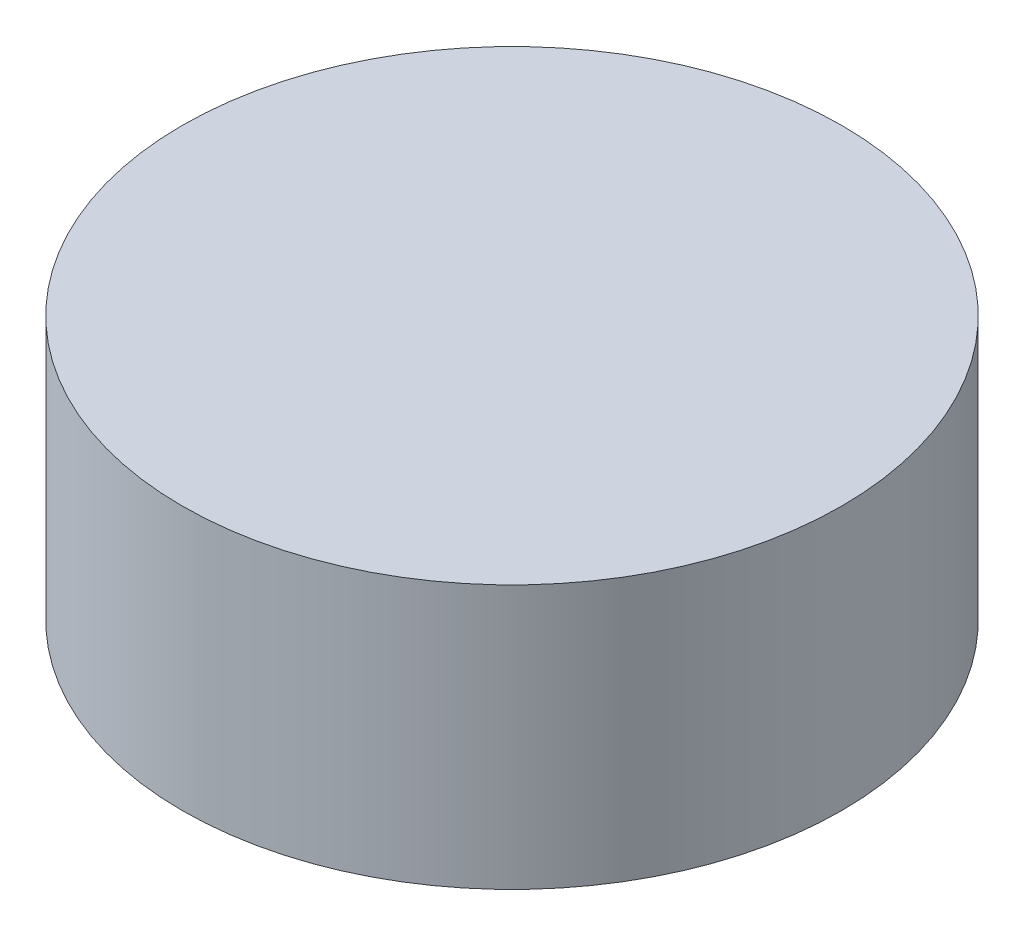
ISO-10303-21;
HEADER;
FILE_DESCRIPTION(('STEP AP214'),'2;1');
FILE_NAME('part.step','',(''),(''),'','','');
FILE_SCHEMA(('AUTOMOTIVE_DESIGN { 1 0 10303 214 1 1 1 1 }'));
ENDSEC;
DATA;
#1=APPLICATION_CONTEXT('core data for automotive mechanical design processes');
#2=APPLICATION_PROTOCOL_DEFINITION('international standard','automotive_design',2000,#1);
#3=PRODUCT_CONTEXT('',#1,'mechanical');
#4=PRODUCT('Part','Part','',(#3));
#5=PRODUCT_RELATED_PRODUCT_CATEGORY('part','',(#4));
#6=PRODUCT_DEFINITION_FORMATION('','',#4);
#7=PRODUCT_DEFINITION_CONTEXT('part definition',#1,'design');
#8=PRODUCT_DEFINITION('design','',#6,#7);
#9=PRODUCT_DEFINITION_SHAPE('','',#8);
#10=(LENGTH_UNIT() NAMED_UNIT(*) SI_UNIT(.MILLI.,.METRE.));
#11=(NAMED_UNIT(*) PLANE_ANGLE_UNIT() SI_UNIT($,.RADIAN.));
#12=(NAMED_UNIT(*) SI_UNIT($,.STERADIAN.) SOLID_ANGLE_UNIT());
#13=UNCERTAINTY_MEASURE_WITH_UNIT(LENGTH_MEASURE(1.E-05),#10,'distance_accuracy_value','');
#14=(GEOMETRIC_REPRESENTATION_CONTEXT(3) GLOBAL_UNCERTAINTY_ASSIGNED_CONTEXT((#13)) GLOBAL_UNIT_ASSIGNED_CONTEXT((#10,
#11,#12)) REPRESENTATION_CONTEXT('',''));
#15=CARTESIAN_POINT('',(0.,0.,0.));
#16=DIRECTION('',(0.,0.,1.));
#17=DIRECTION('',(1.,0.,0.));
#18=AXIS2_PLACEMENT_3D('',#15,#16,#17);
#19=CARTESIAN_POINT('',(0.,26.199999924,0.));
#20=DIRECTION('',(0.,-1.,0.));
#21=DIRECTION('',(0.,0.,-1.));
#22=AXIS2_PLACEMENT_3D('',#19,#20,#21);
#23=CYLINDRICAL_SURFACE('',#22,32.750000032);
#24=CARTESIAN_POINT('',(0.,26.199999924,0.));
#25=DIRECTION('',(0.,1.,0.));
#26=DIRECTION('',(0.,0.,1.));
#27=AXIS2_PLACEMENT_3D('',#24,#25,#26);
#28=CIRCLE('',#27,32.750000032);
#29=CARTESIAN_POINT('',(0.,26.199999924,32.750000032));
#30=VERTEX_POINT('',#29);
#31=EDGE_CURVE('E11',#30,#30,#28,.T.);
#32=ORIENTED_EDGE('',*,*,#31,.F.);
#33=EDGE_LOOP('',(#32));
#34=FACE_BOUND('',#33,.T.);
#35=CARTESIAN_POINT('',(0.,0.,0.));
#36=DIRECTION('',(0.,1.,0.));
#37=DIRECTION('',(0.,0.,1.));
#38=AXIS2_PLACEMENT_3D('',#35,#36,#37);
#39=CIRCLE('',#38,32.750000032);
#40=CARTESIAN_POINT('',(0.,0.,32.750000032));
#41=VERTEX_POINT('',#40);
#42=EDGE_CURVE('E37',#41,#41,#39,.T.);
#43=ORIENTED_EDGE('',*,*,#42,.T.);
#44=EDGE_LOOP('',(#43));
#45=FACE_BOUND('',#44,.T.);
#46=ADVANCED_FACE('F34',(#34,#45),#23,.T.);
#47=CARTESIAN_POINT('',(0.,26.199999924,0.));
#48=DIRECTION('',(0.,1.,0.));
#49=DIRECTION('',(0.,0.,1.));
#50=AXIS2_PLACEMENT_3D('',#47,#48,#49);
#51=PLANE('',#50);
#52=ORIENTED_EDGE('',*,*,#31,.T.);
#53=EDGE_LOOP('',(#52));
#54=FACE_BOUND('',#53,.T.);
#55=ADVANCED_FACE('F151',(#54),#51,.T.);
#56=CARTESIAN_POINT('',(0.,0.,0.));
#57=DIRECTION('',(0.,1.,0.));
#58=DIRECTION('',(0.,0.,1.));
#59=AXIS2_PLACEMENT_3D('',#56,#57,#58);
#60=PLANE('',#59);
#61=CARTESIAN_POINT('',(0.,0.,0.));
#62=DIRECTION('',(0.,-1.,0.));
#63=DIRECTION('',(0.,0.,-1.));
#64=AXIS2_PLACEMENT_3D('',#61,#62,#63);
#65=CIRCLE('',#64,22.749999966);
#66=CARTESIAN_POINT('',(0.,0.,-22.749999966));
#67=VERTEX_POINT('',#66);
#68=EDGE_CURVE('E134',#67,#67,#65,.T.);
#69=ORIENTED_EDGE('',*,*,#68,.F.);
#70=EDGE_LOOP('',(#69));
#71=FACE_BOUND('',#70,.T.);
#72=ORIENTED_EDGE('',*,*,#42,.F.);
#73=EDGE_LOOP('',(#72));
#74=FACE_BOUND('',#73,.T.);
#75=ADVANCED_FACE('F148',(#71,#74),#60,.F.);
#76=CARTESIAN_POINT('',(0.,8.399999964,0.));
#77=DIRECTION('',(0.,-1.,0.));
#78=DIRECTION('',(0.,0.,-1.));
#79=AXIS2_PLACEMENT_3D('',#76,#77,#78);
#80=CYLINDRICAL_SURFACE('',#79,22.749999966);
#81=CARTESIAN_POINT('',(0.,8.399999964,0.));
#82=DIRECTION('',(0.,-1.,0.));
#83=DIRECTION('',(0.,0.,-1.));
#84=AXIS2_PLACEMENT_3D('',#81,#82,#83);
#85=CIRCLE('',#84,22.749999966);
#86=CARTESIAN_POINT('',(0.,8.399999964,-22.749999966));
#87=VERTEX_POINT('',#86);
#88=EDGE_CURVE('E140',#87,#87,#85,.T.);
#89=ORIENTED_EDGE('',*,*,#88,.F.);
#90=EDGE_LOOP('',(#89));
#91=FACE_BOUND('',#90,.T.);
#92=ORIENTED_EDGE('',*,*,#68,.T.);
#93=EDGE_LOOP('',(#92));
#94=FACE_BOUND('',#93,.T.);
#95=ADVANCED_FACE('F146',(#91,#94),#80,.F.);
#96=CARTESIAN_POINT('',(0.,8.399999964,0.));
#97=DIRECTION('',(0.,-1.,0.));
#98=DIRECTION('',(0.,0.,-1.));
#99=AXIS2_PLACEMENT_3D('',#96,#97,#98);
#100=PLANE('',#99);
#101=DIRECTION('',(0.0414097167911969,0.,-0.999142249809942));
#102=VECTOR('',#101,1.);
#103=CARTESIAN_POINT('',(-6.13830090224933,8.399999964,3.2126719473742));
#104=LINE('',#103,#102);
#105=CARTESIAN_POINT('',(-6.13830090224933,8.399999964,3.2126719473742));
#106=VERTEX_POINT('',#105);
#107=CARTESIAN_POINT('',(-5.85140597157634,8.399999964,-3.70958854373376));
#108=VERTEX_POINT('',#107);
#109=EDGE_CURVE('E120',#106,#108,#104,.T.);
#110=ORIENTED_EDGE('',*,*,#109,.F.);
#111=DIRECTION('',(-0.844577711934149,0.,-0.535432991609667));
#112=VECTOR('',#111,1.);
#113=CARTESIAN_POINT('',(-0.286894930672982,8.399999964,6.92226049110795));
#114=LINE('',#113,#112);
#115=CARTESIAN_POINT('',(-0.286894930672982,8.399999964,6.92226049110795));
#116=VERTEX_POINT('',#115);
#117=EDGE_CURVE('E130',#116,#106,#114,.T.);
#118=ORIENTED_EDGE('',*,*,#117,.F.);
#119=DIRECTION('',(-0.885987428725346,0.,0.463709258200275));
#120=VECTOR('',#119,1.);
#121=CARTESIAN_POINT('',(5.85140597157634,8.399999964,3.70958854373376));
#122=LINE('',#121,#120);
#123=CARTESIAN_POINT('',(5.85140597157634,8.399999964,3.70958854373376));
#124=VERTEX_POINT('',#123);
#125=EDGE_CURVE('E48',#124,#116,#122,.T.);
#126=ORIENTED_EDGE('',*,*,#125,.F.);
#127=DIRECTION('',(-0.041409716791197,0.,0.999142249809942));
#128=VECTOR('',#127,1.);
#129=CARTESIAN_POINT('',(6.13830090224933,8.399999964,-3.2126719473742));
#130=LINE('',#129,#128);
#131=CARTESIAN_POINT('',(6.13830090224933,8.399999964,-3.2126719473742));
#132=VERTEX_POINT('',#131);
#133=EDGE_CURVE('E98',#132,#124,#130,.T.);
#134=ORIENTED_EDGE('',*,*,#133,.F.);
#135=DIRECTION('',(0.844577711934149,0.,0.535432991609667));
#136=VECTOR('',#135,1.);
#137=CARTESIAN_POINT('',(0.286894930672983,8.399999964,-6.92226049110795));
#138=LINE('',#137,#136);
#139=CARTESIAN_POINT('',(0.286894930672983,8.399999964,-6.92226049110795));
#140=VERTEX_POINT('',#139);
#141=EDGE_CURVE('E125',#140,#132,#138,.T.);
#142=ORIENTED_EDGE('',*,*,#141,.F.);
#143=DIRECTION('',(0.885987428725346,0.,-0.463709258200276));
#144=VECTOR('',#143,1.);
#145=CARTESIAN_POINT('',(-5.85140597157634,8.399999964,-3.70958854373376));
#146=LINE('',#145,#144);
#147=EDGE_CURVE('E122',#108,#140,#146,.T.);
#148=ORIENTED_EDGE('',*,*,#147,.F.);
#149=EDGE_LOOP('',(#110,#118,#126,#134,#142,#148));
#150=FACE_BOUND('',#149,.T.);
#151=ORIENTED_EDGE('',*,*,#88,.T.);
#152=EDGE_LOOP('',(#151));
#153=FACE_BOUND('',#152,.T.);
#154=ADVANCED_FACE('F168',(#150,#153),#100,.T.);
#155=CARTESIAN_POINT('',(-6.13830090224933,12.899999854,3.2126719473742));
#156=DIRECTION('',(-0.999142249809942,0.,-0.0414097167911969));
#157=DIRECTION('',(-0.0414097167911969,0.,0.999142249809942));
#158=AXIS2_PLACEMENT_3D('',#155,#156,#157);
#159=PLANE('',#158);
#160=ORIENTED_EDGE('',*,*,#109,.T.);
#161=DIRECTION('',(0.,-1.,0.));
#162=VECTOR('',#161,1.);
#163=CARTESIAN_POINT('',(-5.85140597157634,12.899999854,-3.70958854373376));
#164=LINE('',#163,#162);
#165=CARTESIAN_POINT('',(-5.85140597157634,12.899999854,-3.70958854373376));
#166=VERTEX_POINT('',#165);
#167=EDGE_CURVE('E80',#166,#108,#164,.T.);
#168=ORIENTED_EDGE('',*,*,#167,.F.);
#169=DIRECTION('',(0.0414097167911969,0.,-0.999142249809942));
#170=VECTOR('',#169,1.);
#171=CARTESIAN_POINT('',(-6.13830090224933,12.899999854,3.2126719473742));
#172=LINE('',#171,#170);
#173=CARTESIAN_POINT('',(-6.13830090224933,12.899999854,3.2126719473742));
#174=VERTEX_POINT('',#173);
#175=EDGE_CURVE('E132',#174,#166,#172,.T.);
#176=ORIENTED_EDGE('',*,*,#175,.F.);
#177=DIRECTION('',(0.,-1.,0.));
#178=VECTOR('',#177,1.);
#179=CARTESIAN_POINT('',(-6.13830090224933,12.899999854,3.2126719473742));
#180=LINE('',#179,#178);
#181=EDGE_CURVE('E57',#174,#106,#180,.T.);
#182=ORIENTED_EDGE('',*,*,#181,.T.);
#183=EDGE_LOOP('',(#160,#168,#176,#182));
#184=FACE_BOUND('',#183,.T.);
#185=ADVANCED_FACE('F172',(#184),#159,.F.);
#186=CARTESIAN_POINT('',(-0.286894930672982,12.899999854,6.92226049110795));
#187=DIRECTION('',(-0.535432991609667,0.,0.844577711934149));
#188=DIRECTION('',(0.844577711934149,0.,0.535432991609667));
#189=AXIS2_PLACEMENT_3D('',#186,#187,#188);
#190=PLANE('',#189);
#191=ORIENTED_EDGE('',*,*,#117,.T.);
#192=ORIENTED_EDGE('',*,*,#181,.F.);
#193=DIRECTION('',(-0.844577711934149,0.,-0.535432991609667));
#194=VECTOR('',#193,1.);
#195=CARTESIAN_POINT('',(-0.286894930672982,12.899999854,6.92226049110795));
#196=LINE('',#195,#194);
#197=CARTESIAN_POINT('',(-0.286894930672982,12.899999854,6.92226049110795));
#198=VERTEX_POINT('',#197);
#199=EDGE_CURVE('E107',#198,#174,#196,.T.);
#200=ORIENTED_EDGE('',*,*,#199,.F.);
#201=DIRECTION('',(0.,-1.,0.));
#202=VECTOR('',#201,1.);
#203=CARTESIAN_POINT('',(-0.286894930672982,12.899999854,6.92226049110795));
#204=LINE('',#203,#202);
#205=EDGE_CURVE('E99',#198,#116,#204,.T.);
#206=ORIENTED_EDGE('',*,*,#205,.T.);
#207=EDGE_LOOP('',(#191,#192,#200,#206));
#208=FACE_BOUND('',#207,.T.);
#209=ADVANCED_FACE('F176',(#208),#190,.F.);
#210=CARTESIAN_POINT('',(5.85140597157634,12.899999854,3.70958854373376));
#211=DIRECTION('',(0.463709258200275,0.,0.885987428725346));
#212=DIRECTION('',(0.885987428725346,0.,-0.463709258200276));
#213=AXIS2_PLACEMENT_3D('',#210,#211,#212);
#214=PLANE('',#213);
#215=ORIENTED_EDGE('',*,*,#125,.T.);
#216=ORIENTED_EDGE('',*,*,#205,.F.);
#217=DIRECTION('',(-0.885987428725346,0.,0.463709258200275));
#218=VECTOR('',#217,1.);
#219=CARTESIAN_POINT('',(5.85140597157634,12.899999854,3.70958854373376));
#220=LINE('',#219,#218);
#221=CARTESIAN_POINT('',(5.85140597157634,12.899999854,3.70958854373376));
#222=VERTEX_POINT('',#221);
#223=EDGE_CURVE('E103',#222,#198,#220,.T.);
#224=ORIENTED_EDGE('',*,*,#223,.F.);
#225=DIRECTION('',(0.,-1.,0.));
#226=VECTOR('',#225,1.);
#227=CARTESIAN_POINT('',(5.85140597157634,12.899999854,3.70958854373376));
#228=LINE('',#227,#226);
#229=EDGE_CURVE('E91',#222,#124,#228,.T.);
#230=ORIENTED_EDGE('',*,*,#229,.T.);
#231=EDGE_LOOP('',(#215,#216,#224,#230));
#232=FACE_BOUND('',#231,.T.);
#233=ADVANCED_FACE('F104',(#232),#214,.F.);
#234=CARTESIAN_POINT('',(6.13830090224933,12.899999854,-3.2126719473742));
#235=DIRECTION('',(0.999142249809942,0.,0.041409716791197));
#236=DIRECTION('',(0.041409716791197,0.,-0.999142249809942));
#237=AXIS2_PLACEMENT_3D('',#234,#235,#236);
#238=PLANE('',#237);
#239=ORIENTED_EDGE('',*,*,#133,.T.);
#240=ORIENTED_EDGE('',*,*,#229,.F.);
#241=DIRECTION('',(-0.041409716791197,0.,0.999142249809942));
#242=VECTOR('',#241,1.);
#243=CARTESIAN_POINT('',(6.13830090224933,12.899999854,-3.2126719473742));
#244=LINE('',#243,#242);
#245=CARTESIAN_POINT('',(6.13830090224933,12.899999854,-3.2126719473742));
#246=VERTEX_POINT('',#245);
#247=EDGE_CURVE('E95',#246,#222,#244,.T.);
#248=ORIENTED_EDGE('',*,*,#247,.F.);
#249=DIRECTION('',(0.,-1.,0.));
#250=VECTOR('',#249,1.);
#251=CARTESIAN_POINT('',(6.13830090224933,12.899999854,-3.2126719473742));
#252=LINE('',#251,#250);
#253=EDGE_CURVE('E100',#246,#132,#252,.T.);
#254=ORIENTED_EDGE('',*,*,#253,.T.);
#255=EDGE_LOOP('',(#239,#240,#248,#254));
#256=FACE_BOUND('',#255,.T.);
#257=ADVANCED_FACE('F93',(#256),#238,.F.);
#258=CARTESIAN_POINT('',(0.286894930672983,12.899999854,-6.92226049110795));
#259=DIRECTION('',(0.535432991609667,0.,-0.844577711934149));
#260=DIRECTION('',(-0.844577711934149,0.,-0.535432991609667));
#261=AXIS2_PLACEMENT_3D('',#258,#259,#260);
#262=PLANE('',#261);
#263=ORIENTED_EDGE('',*,*,#141,.T.);
#264=ORIENTED_EDGE('',*,*,#253,.F.);
#265=DIRECTION('',(0.844577711934149,0.,0.535432991609667));
#266=VECTOR('',#265,1.);
#267=CARTESIAN_POINT('',(0.286894930672983,12.899999854,-6.92226049110795));
#268=LINE('',#267,#266);
#269=CARTESIAN_POINT('',(0.286894930672983,12.899999854,-6.92226049110795));
#270=VERTEX_POINT('',#269);
#271=EDGE_CURVE('E113',#270,#246,#268,.T.);
#272=ORIENTED_EDGE('',*,*,#271,.F.);
#273=DIRECTION('',(0.,-1.,0.));
#274=VECTOR('',#273,1.);
#275=CARTESIAN_POINT('',(0.286894930672983,12.899999854,-6.92226049110795));
#276=LINE('',#275,#274);
#277=EDGE_CURVE('E137',#270,#140,#276,.T.);
#278=ORIENTED_EDGE('',*,*,#277,.T.);
#279=EDGE_LOOP('',(#263,#264,#272,#278));
#280=FACE_BOUND('',#279,.T.);
#281=ADVANCED_FACE('F180',(#280),#262,.F.);
#282=CARTESIAN_POINT('',(-5.85140597157634,12.899999854,-3.70958854373376));
#283=DIRECTION('',(-0.463709258200276,0.,-0.885987428725346));
#284=DIRECTION('',(-0.885987428725346,0.,0.463709258200276));
#285=AXIS2_PLACEMENT_3D('',#282,#283,#284);
#286=PLANE('',#285);
#287=ORIENTED_EDGE('',*,*,#147,.T.);
#288=ORIENTED_EDGE('',*,*,#277,.F.);
#289=DIRECTION('',(0.885987428725346,0.,-0.463709258200276));
#290=VECTOR('',#289,1.);
#291=CARTESIAN_POINT('',(-5.85140597157634,12.899999854,-3.70958854373376));
#292=LINE('',#291,#290);
#293=EDGE_CURVE('E115',#166,#270,#292,.T.);
#294=ORIENTED_EDGE('',*,*,#293,.F.);
#295=ORIENTED_EDGE('',*,*,#167,.T.);
#296=EDGE_LOOP('',(#287,#288,#294,#295));
#297=FACE_BOUND('',#296,.T.);
#298=ADVANCED_FACE('F177',(#297),#286,.F.);
#299=CARTESIAN_POINT('',(0.,12.899999854,0.));
#300=DIRECTION('',(0.,-1.,0.));
#301=DIRECTION('',(0.,0.,-1.));
#302=AXIS2_PLACEMENT_3D('',#299,#300,#301);
#303=PLANE('',#302);
#304=ORIENTED_EDGE('',*,*,#175,.T.);
#305=ORIENTED_EDGE('',*,*,#293,.T.);
#306=ORIENTED_EDGE('',*,*,#271,.T.);
#307=ORIENTED_EDGE('',*,*,#247,.T.);
#308=ORIENTED_EDGE('',*,*,#223,.T.);
#309=ORIENTED_EDGE('',*,*,#199,.T.);
#310=EDGE_LOOP('',(#304,#305,#306,#307,#308,#309));
#311=FACE_BOUND('',#310,.T.);
#312=ADVANCED_FACE('F110',(#311),#303,.T.);
#313=CLOSED_SHELL('',(#46,#55,#75,#95,#154,#185,#209,#233,#257,#281,#298,#312));
#314=MANIFOLD_SOLID_BREP('B2',#313);
#315=ADVANCED_BREP_SHAPE_REPRESENTATION('',(#18,#314),#14);
#316=SHAPE_DEFINITION_REPRESENTATION(#9,#315);
ENDSEC;
END-ISO-10303-21;
